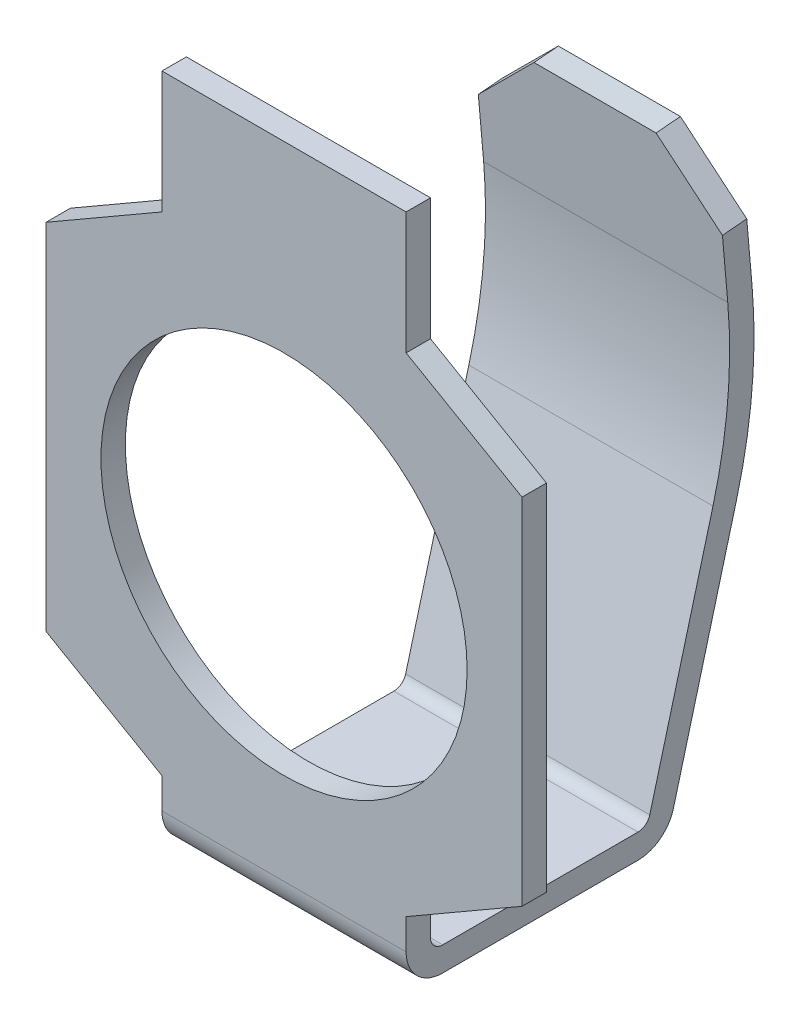
ISO-10303-21;
HEADER;
FILE_DESCRIPTION(('STEP AP214'),'2;1');
FILE_NAME('part.step','',(''),(''),'','','');
FILE_SCHEMA(('AUTOMOTIVE_DESIGN { 1 0 10303 214 1 1 1 1 }'));
ENDSEC;
DATA;
#1=APPLICATION_CONTEXT('core data for automotive mechanical design processes');
#2=APPLICATION_PROTOCOL_DEFINITION('international standard','automotive_design',2000,#1);
#3=PRODUCT_CONTEXT('',#1,'mechanical');
#4=PRODUCT('Part','Part','',(#3));
#5=PRODUCT_RELATED_PRODUCT_CATEGORY('part','',(#4));
#6=PRODUCT_DEFINITION_FORMATION('','',#4);
#7=PRODUCT_DEFINITION_CONTEXT('part definition',#1,'design');
#8=PRODUCT_DEFINITION('design','',#6,#7);
#9=PRODUCT_DEFINITION_SHAPE('','',#8);
#10=(LENGTH_UNIT() NAMED_UNIT(*) SI_UNIT(.MILLI.,.METRE.));
#11=(NAMED_UNIT(*) PLANE_ANGLE_UNIT() SI_UNIT($,.RADIAN.));
#12=(NAMED_UNIT(*) SI_UNIT($,.STERADIAN.) SOLID_ANGLE_UNIT());
#13=UNCERTAINTY_MEASURE_WITH_UNIT(LENGTH_MEASURE(1.E-05),#10,'distance_accuracy_value','');
#14=(GEOMETRIC_REPRESENTATION_CONTEXT(3) GLOBAL_UNCERTAINTY_ASSIGNED_CONTEXT((#13)) GLOBAL_UNIT_ASSIGNED_CONTEXT((#10,
#11,#12)) REPRESENTATION_CONTEXT('',''));
#15=CARTESIAN_POINT('',(0.,0.,0.));
#16=DIRECTION('',(0.,0.,1.));
#17=DIRECTION('',(1.,0.,0.));
#18=AXIS2_PLACEMENT_3D('',#15,#16,#17);
#19=CARTESIAN_POINT('',(0.,-6.70559839852,-3.313710709838));
#20=DIRECTION('',(0.,0.0871557427476379,-0.996194698091747));
#21=DIRECTION('',(0.,0.996194698091747,0.0871557427476379));
#22=AXIS2_PLACEMENT_3D('',#19,#20,#21);
#23=PLANE('',#22);
#24=DIRECTION('',(-1.,0.,0.));
#25=VECTOR('',#24,1.);
#26=CARTESIAN_POINT('',(1.,1.05730004801803,-2.63454509966334));
#27=LINE('',#26,#25);
#28=CARTESIAN_POINT('',(-0.999999999999995,1.05730004801875,-2.63454509966311));
#29=VERTEX_POINT('',#28);
#30=CARTESIAN_POINT('',(1.,1.05730004801875,-2.63454509966311));
#31=VERTEX_POINT('',#30);
#32=EDGE_CURVE('E194',#29,#31,#27,.F.);
#33=ORIENTED_EDGE('',*,*,#32,.F.);
#34=DIRECTION('',(0.,-0.996194698091718,-0.0871557427479758));
#35=VECTOR('',#34,1.);
#36=CARTESIAN_POINT('',(-1.,1.555397397064,-2.590967228289));
#37=LINE('',#36,#35);
#38=CARTESIAN_POINT('',(-1.00000000000007,1.55539739706407,-2.59096722828899));
#39=VERTEX_POINT('',#38);
#40=EDGE_CURVE('E210',#39,#29,#37,.T.);
#41=ORIENTED_EDGE('',*,*,#40,.F.);
#42=DIRECTION('',(0.707106781186442,0.704416026402845,0.0616284167164527));
#43=VECTOR('',#42,1.);
#44=CARTESIAN_POINT('',(-1.00000000000011,1.55539739706411,-2.59096722828899));
#45=LINE('',#44,#43);
#46=CARTESIAN_POINT('',(-0.500000000000116,2.05349474610991,-2.54738935691501));
#47=VERTEX_POINT('',#46);
#48=EDGE_CURVE('E213',#39,#47,#45,.T.);
#49=ORIENTED_EDGE('',*,*,#48,.T.);
#50=DIRECTION('',(1.,0.,0.));
#51=VECTOR('',#50,1.);
#52=CARTESIAN_POINT('',(-1.,2.0534947461095,-2.54738935691504));
#53=LINE('',#52,#51);
#54=CARTESIAN_POINT('',(0.500000000000046,2.05349474610988,-2.54738935691501));
#55=VERTEX_POINT('',#54);
#56=EDGE_CURVE('E226',#55,#47,#53,.F.);
#57=ORIENTED_EDGE('',*,*,#56,.F.);
#58=DIRECTION('',(0.707106781186442,-0.704416026402845,-0.0616284167164533));
#59=VECTOR('',#58,1.);
#60=CARTESIAN_POINT('',(0.500000000000069,2.05349474611007,-2.547389356915));
#61=LINE('',#60,#59);
#62=CARTESIAN_POINT('',(1.00000000000002,1.55539739706402,-2.590967228289));
#63=VERTEX_POINT('',#62);
#64=EDGE_CURVE('E209',#55,#63,#61,.T.);
#65=ORIENTED_EDGE('',*,*,#64,.T.);
#66=DIRECTION('',(0.,0.996194698091718,0.0871557427479758));
#67=VECTOR('',#66,1.);
#68=CARTESIAN_POINT('',(1.,1.057300048018,-2.634545099663));
#69=LINE('',#68,#67);
#70=EDGE_CURVE('E206',#31,#63,#69,.T.);
#71=ORIENTED_EDGE('',*,*,#70,.F.);
#72=EDGE_LOOP('',(#33,#41,#49,#57,#65,#71));
#73=FACE_BOUND('',#72,.T.);
#74=ADVANCED_FACE('F17',(#73),#23,.T.);
#75=CARTESIAN_POINT('',(-1.,2.03606359756,-2.348150417297));
#76=DIRECTION('',(0.,0.996194698091747,0.0871557427476379));
#77=DIRECTION('',(0.,-0.0871557427476379,0.996194698091747));
#78=AXIS2_PLACEMENT_3D('',#75,#76,#77);
#79=PLANE('',#78);
#80=DIRECTION('',(-1.25659031791263E-12,0.0871557427488806,-0.996194698091639));
#81=VECTOR('',#80,1.);
#82=CARTESIAN_POINT('',(0.50000000000032,2.03606359756032,-2.34815041729697));
#83=LINE('',#82,#81);
#84=CARTESIAN_POINT('',(0.500000000000107,2.03606359756014,-2.34815041729741));
#85=VERTEX_POINT('',#84);
#86=EDGE_CURVE('E215',#85,#55,#83,.T.);
#87=ORIENTED_EDGE('',*,*,#86,.T.);
#88=ORIENTED_EDGE('',*,*,#56,.T.);
#89=DIRECTION('',(-1.25713241899887E-12,-0.0871557427488804,0.996194698091639));
#90=VECTOR('',#89,1.);
#91=CARTESIAN_POINT('',(-0.500000000000116,2.05349474611012,-2.54738935691499));
#92=LINE('',#91,#90);
#93=CARTESIAN_POINT('',(-0.500000000000184,2.03606359756016,-2.3481504172974));
#94=VERTEX_POINT('',#93);
#95=EDGE_CURVE('E223',#47,#94,#92,.T.);
#96=ORIENTED_EDGE('',*,*,#95,.T.);
#97=DIRECTION('',(1.,0.,0.));
#98=VECTOR('',#97,1.);
#99=CARTESIAN_POINT('',(0.,2.03606359756004,-2.34815041729742));
#100=LINE('',#99,#98);
#101=EDGE_CURVE('E273',#94,#85,#100,.T.);
#102=ORIENTED_EDGE('',*,*,#101,.T.);
#103=EDGE_LOOP('',(#87,#88,#96,#102));
#104=FACE_BOUND('',#103,.T.);
#105=ADVANCED_FACE('F307',(#104),#79,.T.);
#106=CARTESIAN_POINT('',(0.5,1.914045557714,-0.953477839969));
#107=DIRECTION('',(-0.707106781186654,-0.704416026402655,-0.0616284167161898));
#108=DIRECTION('',(0.705757556807847,-0.708453436020053,0.));
#109=AXIS2_PLACEMENT_3D('',#106,#107,#108);
#110=PLANE('',#109);
#111=DIRECTION('',(0.707106781186448,-0.704416026402859,-0.0616284167162135));
#112=VECTOR('',#111,1.);
#113=CARTESIAN_POINT('',(0.5,2.03606359756004,-2.34815041729742));
#114=LINE('',#113,#112);
#115=CARTESIAN_POINT('',(1.,1.53796624851402,-2.39172828867125));
#116=VERTEX_POINT('',#115);
#117=EDGE_CURVE('E276',#85,#116,#114,.T.);
#118=ORIENTED_EDGE('',*,*,#117,.T.);
#119=DIRECTION('',(0.,-0.0871557427501339,0.996194698091529));
#120=VECTOR('',#119,1.);
#121=CARTESIAN_POINT('',(1.,1.555397397064,-2.590967228289));
#122=LINE('',#121,#120);
#123=EDGE_CURVE('E211',#63,#116,#122,.T.);
#124=ORIENTED_EDGE('',*,*,#123,.F.);
#125=ORIENTED_EDGE('',*,*,#64,.F.);
#126=ORIENTED_EDGE('',*,*,#86,.F.);
#127=EDGE_LOOP('',(#118,#124,#125,#126));
#128=FACE_BOUND('',#127,.T.);
#129=ADVANCED_FACE('F310',(#128),#110,.F.);
#130=CARTESIAN_POINT('',(-1.,1.415948208668,-0.997055711342));
#131=DIRECTION('',(0.707106781186654,-0.704416026402655,-0.0616284167161898));
#132=DIRECTION('',(0.705757556807847,0.708453436020053,0.));
#133=AXIS2_PLACEMENT_3D('',#130,#131,#132);
#134=PLANE('',#133);
#135=DIRECTION('',(0.707106781186448,0.704416026402859,0.0616284167162135));
#136=VECTOR('',#135,1.);
#137=CARTESIAN_POINT('',(-1.,1.53796624851402,-2.39172828867125));
#138=LINE('',#137,#136);
#139=CARTESIAN_POINT('',(-1.00000000000012,1.53796624851414,-2.39172828867124));
#140=VERTEX_POINT('',#139);
#141=EDGE_CURVE('E320',#140,#94,#138,.T.);
#142=ORIENTED_EDGE('',*,*,#141,.T.);
#143=ORIENTED_EDGE('',*,*,#95,.F.);
#144=ORIENTED_EDGE('',*,*,#48,.F.);
#145=DIRECTION('',(1.25659031791263E-12,0.0871557427488815,-0.996194698091639));
#146=VECTOR('',#145,1.);
#147=CARTESIAN_POINT('',(-1.00000000000036,1.53796624851436,-2.39172828867097));
#148=LINE('',#147,#146);
#149=EDGE_CURVE('E201',#140,#39,#148,.T.);
#150=ORIENTED_EDGE('',*,*,#149,.F.);
#151=EDGE_LOOP('',(#142,#143,#144,#150));
#152=FACE_BOUND('',#151,.T.);
#153=ADVANCED_FACE('F733',(#152),#134,.F.);
#154=CARTESIAN_POINT('',(1.,0.691245928478,1.549472632322));
#155=DIRECTION('',(-1.,0.,0.));
#156=DIRECTION('',(0.,0.,1.));
#157=AXIS2_PLACEMENT_3D('',#154,#155,#156);
#158=CYLINDRICAL_SURFACE('',#157,4.2);
#159=DIRECTION('',(1.,0.,0.));
#160=VECTOR('',#159,1.);
#161=CARTESIAN_POINT('',(0.,-0.395794060953725,-2.50741583809471));
#162=LINE('',#161,#160);
#163=CARTESIAN_POINT('',(-1.,-0.395794060953155,-2.50741583809341));
#164=VERTEX_POINT('',#163);
#165=CARTESIAN_POINT('',(1.,-0.395794060953155,-2.50741583809341));
#166=VERTEX_POINT('',#165);
#167=EDGE_CURVE('E326',#164,#166,#162,.T.);
#168=ORIENTED_EDGE('',*,*,#167,.F.);
#169=CARTESIAN_POINT('',(-1.,0.691245928478,1.549472632322));
#170=DIRECTION('',(-1.,0.,0.));
#171=DIRECTION('',(0.,0.,1.));
#172=AXIS2_PLACEMENT_3D('',#169,#170,#171);
#173=CIRCLE('',#172,4.2);
#174=EDGE_CURVE('E197',#29,#164,#173,.T.);
#175=ORIENTED_EDGE('',*,*,#174,.F.);
#176=ORIENTED_EDGE('',*,*,#32,.T.);
#177=CARTESIAN_POINT('',(1.,0.691245928478,1.549472632322));
#178=DIRECTION('',(-1.,0.,0.));
#179=DIRECTION('',(0.,0.,1.));
#180=AXIS2_PLACEMENT_3D('',#177,#178,#179);
#181=CIRCLE('',#180,4.2);
#182=EDGE_CURVE('E20',#166,#31,#181,.F.);
#183=ORIENTED_EDGE('',*,*,#182,.F.);
#184=EDGE_LOOP('',(#168,#175,#176,#183));
#185=FACE_BOUND('',#184,.T.);
#186=ADVANCED_FACE('F196',(#185),#158,.T.);
#187=CARTESIAN_POINT('',(0.,-6.72302954707,-3.11447177022));
#188=DIRECTION('',(0.,0.0871557427476379,-0.996194698091747));
#189=DIRECTION('',(0.,0.996194698091747,0.0871557427476379));
#190=AXIS2_PLACEMENT_3D('',#187,#188,#189);
#191=PLANE('',#190);
#192=DIRECTION('',(0.,0.996194698091747,0.0871557427476379));
#193=VECTOR('',#192,1.);
#194=CARTESIAN_POINT('',(-1.,-6.72302954707,-3.11447177022));
#195=LINE('',#194,#193);
#196=CARTESIAN_POINT('',(-0.999999999999996,1.03986889946878,-2.43530616004499));
#197=VERTEX_POINT('',#196);
#198=EDGE_CURVE('E318',#197,#140,#195,.T.);
#199=ORIENTED_EDGE('',*,*,#198,.F.);
#200=DIRECTION('',(1.,0.,0.));
#201=VECTOR('',#200,1.);
#202=CARTESIAN_POINT('',(-1.,1.039868899469,-2.43530616004495));
#203=LINE('',#202,#201);
#204=CARTESIAN_POINT('',(1.,1.03986889946878,-2.43530616004499));
#205=VERTEX_POINT('',#204);
#206=EDGE_CURVE('E270',#197,#205,#203,.T.);
#207=ORIENTED_EDGE('',*,*,#206,.T.);
#208=DIRECTION('',(0.,0.996194698091747,0.0871557427476379));
#209=VECTOR('',#208,1.);
#210=CARTESIAN_POINT('',(1.,-6.72302954707,-3.11447177022));
#211=LINE('',#210,#209);
#212=EDGE_CURVE('E282',#116,#205,#211,.F.);
#213=ORIENTED_EDGE('',*,*,#212,.F.);
#214=ORIENTED_EDGE('',*,*,#117,.F.);
#215=ORIENTED_EDGE('',*,*,#101,.F.);
#216=ORIENTED_EDGE('',*,*,#141,.F.);
#217=EDGE_LOOP('',(#199,#207,#213,#214,#215,#216));
#218=FACE_BOUND('',#217,.T.);
#219=ADVANCED_FACE('F313',(#218),#191,.F.);
#220=CARTESIAN_POINT('',(0.,-6.547160148908,-0.859162262476));
#221=DIRECTION('',(0.,-0.258819045102985,-0.965925826288944));
#222=DIRECTION('',(0.,0.965925826288944,-0.258819045102985));
#223=AXIS2_PLACEMENT_3D('',#220,#221,#222);
#224=PLANE('',#223);
#225=ORIENTED_EDGE('',*,*,#167,.T.);
#226=DIRECTION('',(0.,0.965925826289069,-0.258819045102519));
#227=VECTOR('',#226,1.);
#228=CARTESIAN_POINT('',(1.,-2.327645713531,-1.989777747887));
#229=LINE('',#228,#227);
#230=CARTESIAN_POINT('',(1.,-2.32764571353088,-1.98977774788686));
#231=VERTEX_POINT('',#230);
#232=EDGE_CURVE('E187',#231,#166,#229,.T.);
#233=ORIENTED_EDGE('',*,*,#232,.F.);
#234=DIRECTION('',(-1.,0.,0.));
#235=VECTOR('',#234,1.);
#236=CARTESIAN_POINT('',(1.,-2.32764571353091,-1.98977774788668));
#237=LINE('',#236,#235);
#238=CARTESIAN_POINT('',(-1.,-2.32764571353088,-1.98977774788686));
#239=VERTEX_POINT('',#238);
#240=EDGE_CURVE('E266',#239,#231,#237,.F.);
#241=ORIENTED_EDGE('',*,*,#240,.F.);
#242=DIRECTION('',(0.,-0.965925826289069,0.258819045102519));
#243=VECTOR('',#242,1.);
#244=CARTESIAN_POINT('',(-1.,-0.395794060953,-2.507415838092));
#245=LINE('',#244,#243);
#246=EDGE_CURVE('E272',#164,#239,#245,.T.);
#247=ORIENTED_EDGE('',*,*,#246,.F.);
#248=EDGE_LOOP('',(#225,#233,#241,#247));
#249=FACE_BOUND('',#248,.T.);
#250=ADVANCED_FACE('F515',(#249),#224,.T.);
#251=CARTESIAN_POINT('',(-1.,0.691245928478,1.549472632322));
#252=DIRECTION('',(1.,0.,0.));
#253=DIRECTION('',(0.,0.,-1.));
#254=AXIS2_PLACEMENT_3D('',#251,#252,#253);
#255=CYLINDRICAL_SURFACE('',#254,4.);
#256=CARTESIAN_POINT('',(-1.,0.691245928478,1.549472632322));
#257=DIRECTION('',(1.,0.,0.));
#258=DIRECTION('',(0.,0.,-1.));
#259=AXIS2_PLACEMENT_3D('',#256,#257,#258);
#260=CIRCLE('',#259,4.);
#261=CARTESIAN_POINT('',(-1.,-0.344030251933333,-2.31423067283524));
#262=VERTEX_POINT('',#261);
#263=EDGE_CURVE('E267',#262,#197,#260,.T.);
#264=ORIENTED_EDGE('',*,*,#263,.F.);
#265=DIRECTION('',(1.,0.,0.));
#266=VECTOR('',#265,1.);
#267=CARTESIAN_POINT('',(0.,-0.344030251932726,-2.31423067283671));
#268=LINE('',#267,#266);
#269=CARTESIAN_POINT('',(1.,-0.344030251933333,-2.31423067283524));
#270=VERTEX_POINT('',#269);
#271=EDGE_CURVE('E343',#262,#270,#268,.T.);
#272=ORIENTED_EDGE('',*,*,#271,.T.);
#273=CARTESIAN_POINT('',(1.,0.691245928478,1.549472632322));
#274=DIRECTION('',(1.,0.,0.));
#275=DIRECTION('',(0.,0.,-1.));
#276=AXIS2_PLACEMENT_3D('',#273,#274,#275);
#277=CIRCLE('',#276,4.);
#278=EDGE_CURVE('E271',#205,#270,#277,.F.);
#279=ORIENTED_EDGE('',*,*,#278,.F.);
#280=ORIENTED_EDGE('',*,*,#206,.F.);
#281=EDGE_LOOP('',(#264,#272,#279,#280));
#282=FACE_BOUND('',#281,.T.);
#283=ADVANCED_FACE('F517',(#282),#255,.F.);
#284=CARTESIAN_POINT('',(1.,-2.25,-1.7));
#285=DIRECTION('',(-1.,0.,0.));
#286=DIRECTION('',(0.,0.,1.));
#287=AXIS2_PLACEMENT_3D('',#284,#285,#286);
#288=CYLINDRICAL_SURFACE('',#287,0.3);
#289=DIRECTION('',(1.,0.,0.));
#290=VECTOR('',#289,1.);
#291=CARTESIAN_POINT('',(0.,-2.55,-1.7));
#292=LINE('',#291,#290);
#293=CARTESIAN_POINT('',(-1.,-2.55,-1.7));
#294=VERTEX_POINT('',#293);
#295=CARTESIAN_POINT('',(1.,-2.55,-1.7));
#296=VERTEX_POINT('',#295);
#297=EDGE_CURVE('E261',#294,#296,#292,.T.);
#298=ORIENTED_EDGE('',*,*,#297,.F.);
#299=CARTESIAN_POINT('',(-1.,-2.25,-1.7));
#300=DIRECTION('',(-1.,0.,0.));
#301=DIRECTION('',(0.,0.,1.));
#302=AXIS2_PLACEMENT_3D('',#299,#300,#301);
#303=CIRCLE('',#302,0.3);
#304=EDGE_CURVE('E263',#239,#294,#303,.T.);
#305=ORIENTED_EDGE('',*,*,#304,.F.);
#306=ORIENTED_EDGE('',*,*,#240,.T.);
#307=CARTESIAN_POINT('',(1.,-2.25,-1.7));
#308=DIRECTION('',(-1.,0.,0.));
#309=DIRECTION('',(0.,0.,1.));
#310=AXIS2_PLACEMENT_3D('',#307,#308,#309);
#311=CIRCLE('',#310,0.3);
#312=EDGE_CURVE('E259',#296,#231,#311,.F.);
#313=ORIENTED_EDGE('',*,*,#312,.F.);
#314=EDGE_LOOP('',(#298,#305,#306,#313));
#315=FACE_BOUND('',#314,.T.);
#316=ADVANCED_FACE('F512',(#315),#288,.T.);
#317=CARTESIAN_POINT('',(0.,-6.495396339887,-0.665977097218));
#318=DIRECTION('',(0.,-0.258819045102985,-0.965925826288944));
#319=DIRECTION('',(0.,0.965925826288944,-0.258819045102985));
#320=AXIS2_PLACEMENT_3D('',#317,#318,#319);
#321=PLANE('',#320);
#322=DIRECTION('',(0.,0.965925826288944,-0.258819045102985));
#323=VECTOR('',#322,1.);
#324=CARTESIAN_POINT('',(1.,-6.495396339887,-0.665977097218));
#325=LINE('',#324,#323);
#326=CARTESIAN_POINT('',(1.,-2.27588190451039,-1.79659258262984));
#327=VERTEX_POINT('',#326);
#328=EDGE_CURVE('E262',#270,#327,#325,.F.);
#329=ORIENTED_EDGE('',*,*,#328,.F.);
#330=ORIENTED_EDGE('',*,*,#271,.F.);
#331=DIRECTION('',(0.,0.965925826288944,-0.258819045102985));
#332=VECTOR('',#331,1.);
#333=CARTESIAN_POINT('',(-1.,-6.495396339887,-0.665977097218));
#334=LINE('',#333,#332);
#335=CARTESIAN_POINT('',(-1.,-2.27588190451039,-1.79659258262984));
#336=VERTEX_POINT('',#335);
#337=EDGE_CURVE('E265',#336,#262,#334,.T.);
#338=ORIENTED_EDGE('',*,*,#337,.F.);
#339=DIRECTION('',(1.,0.,0.));
#340=VECTOR('',#339,1.);
#341=CARTESIAN_POINT('',(-1.,-2.27588190450999,-1.79659258262898));
#342=LINE('',#341,#340);
#343=EDGE_CURVE('E255',#336,#327,#342,.T.);
#344=ORIENTED_EDGE('',*,*,#343,.T.);
#345=EDGE_LOOP('',(#329,#330,#338,#344));
#346=FACE_BOUND('',#345,.T.);
#347=ADVANCED_FACE('F576',(#346),#321,.F.);
#348=CARTESIAN_POINT('',(0.,-2.55,2.432743338823));
#349=DIRECTION('',(0.,-1.,0.));
#350=DIRECTION('',(0.,0.,-1.));
#351=AXIS2_PLACEMENT_3D('',#348,#349,#350);
#352=PLANE('',#351);
#353=ORIENTED_EDGE('',*,*,#297,.T.);
#354=DIRECTION('',(0.,0.,-1.));
#355=VECTOR('',#354,1.);
#356=CARTESIAN_POINT('',(1.,-2.55,-1.7));
#357=LINE('',#356,#355);
#358=CARTESIAN_POINT('',(1.,-2.55,-0.1));
#359=VERTEX_POINT('',#358);
#360=EDGE_CURVE('E352',#359,#296,#357,.T.);
#361=ORIENTED_EDGE('',*,*,#360,.F.);
#362=DIRECTION('',(-1.,0.,0.));
#363=VECTOR('',#362,1.);
#364=CARTESIAN_POINT('',(1.,-2.55,-0.1));
#365=LINE('',#364,#363);
#366=CARTESIAN_POINT('',(-1.,-2.55,-0.1));
#367=VERTEX_POINT('',#366);
#368=EDGE_CURVE('E251',#367,#359,#365,.F.);
#369=ORIENTED_EDGE('',*,*,#368,.F.);
#370=DIRECTION('',(0.,0.,1.));
#371=VECTOR('',#370,1.);
#372=CARTESIAN_POINT('',(-1.,-2.55,-0.1));
#373=LINE('',#372,#371);
#374=EDGE_CURVE('E258',#294,#367,#373,.T.);
#375=ORIENTED_EDGE('',*,*,#374,.F.);
#376=EDGE_LOOP('',(#353,#361,#369,#375));
#377=FACE_BOUND('',#376,.T.);
#378=ADVANCED_FACE('F514',(#377),#352,.T.);
#379=CARTESIAN_POINT('',(-1.,-2.25,-1.7));
#380=DIRECTION('',(1.,0.,0.));
#381=DIRECTION('',(0.,0.,-1.));
#382=AXIS2_PLACEMENT_3D('',#379,#380,#381);
#383=CYLINDRICAL_SURFACE('',#382,0.1);
#384=CARTESIAN_POINT('',(-1.,-2.25,-1.7));
#385=DIRECTION('',(1.,0.,0.));
#386=DIRECTION('',(0.,0.,-1.));
#387=AXIS2_PLACEMENT_3D('',#384,#385,#386);
#388=CIRCLE('',#387,0.1);
#389=CARTESIAN_POINT('',(-1.,-2.35,-1.7));
#390=VERTEX_POINT('',#389);
#391=EDGE_CURVE('E252',#390,#336,#388,.T.);
#392=ORIENTED_EDGE('',*,*,#391,.F.);
#393=DIRECTION('',(1.,0.,0.));
#394=VECTOR('',#393,1.);
#395=CARTESIAN_POINT('',(0.,-2.35,-1.7));
#396=LINE('',#395,#394);
#397=CARTESIAN_POINT('',(1.,-2.35,-1.7));
#398=VERTEX_POINT('',#397);
#399=EDGE_CURVE('E357',#390,#398,#396,.T.);
#400=ORIENTED_EDGE('',*,*,#399,.T.);
#401=CARTESIAN_POINT('',(1.,-2.25,-1.7));
#402=DIRECTION('',(1.,0.,0.));
#403=DIRECTION('',(0.,0.,-1.));
#404=AXIS2_PLACEMENT_3D('',#401,#402,#403);
#405=CIRCLE('',#404,0.1);
#406=EDGE_CURVE('E256',#327,#398,#405,.F.);
#407=ORIENTED_EDGE('',*,*,#406,.F.);
#408=ORIENTED_EDGE('',*,*,#343,.F.);
#409=EDGE_LOOP('',(#392,#400,#407,#408));
#410=FACE_BOUND('',#409,.T.);
#411=ADVANCED_FACE('F570',(#410),#383,.F.);
#412=CARTESIAN_POINT('',(1.,-2.25,-0.1));
#413=DIRECTION('',(-1.,0.,0.));
#414=DIRECTION('',(0.,0.,1.));
#415=AXIS2_PLACEMENT_3D('',#412,#413,#414);
#416=CYLINDRICAL_SURFACE('',#415,0.3);
#417=DIRECTION('',(1.,0.,0.));
#418=VECTOR('',#417,1.);
#419=CARTESIAN_POINT('',(0.,-2.25,0.2));
#420=LINE('',#419,#418);
#421=CARTESIAN_POINT('',(-1.,-2.25,0.2));
#422=VERTEX_POINT('',#421);
#423=CARTESIAN_POINT('',(1.,-2.25,0.2));
#424=VERTEX_POINT('',#423);
#425=EDGE_CURVE('E246',#422,#424,#420,.T.);
#426=ORIENTED_EDGE('',*,*,#425,.F.);
#427=CARTESIAN_POINT('',(-1.,-2.25,-0.1));
#428=DIRECTION('',(-1.,0.,0.));
#429=DIRECTION('',(0.,0.,1.));
#430=AXIS2_PLACEMENT_3D('',#427,#428,#429);
#431=CIRCLE('',#430,0.3);
#432=EDGE_CURVE('E248',#367,#422,#431,.T.);
#433=ORIENTED_EDGE('',*,*,#432,.F.);
#434=ORIENTED_EDGE('',*,*,#368,.T.);
#435=CARTESIAN_POINT('',(1.,-2.25,-0.1));
#436=DIRECTION('',(-1.,0.,0.));
#437=DIRECTION('',(0.,0.,1.));
#438=AXIS2_PLACEMENT_3D('',#435,#436,#437);
#439=CIRCLE('',#438,0.3);
#440=EDGE_CURVE('E244',#424,#359,#439,.F.);
#441=ORIENTED_EDGE('',*,*,#440,.F.);
#442=EDGE_LOOP('',(#426,#433,#434,#441));
#443=FACE_BOUND('',#442,.T.);
#444=ADVANCED_FACE('F507',(#443),#416,.T.);
#445=CARTESIAN_POINT('',(0.,-2.35,2.432743338823));
#446=DIRECTION('',(0.,-1.,0.));
#447=DIRECTION('',(0.,0.,-1.));
#448=AXIS2_PLACEMENT_3D('',#445,#446,#447);
#449=PLANE('',#448);
#450=DIRECTION('',(0.,0.,-1.));
#451=VECTOR('',#450,1.);
#452=CARTESIAN_POINT('',(1.,-2.35,2.432743338823));
#453=LINE('',#452,#451);
#454=CARTESIAN_POINT('',(1.,-2.35,-0.1));
#455=VERTEX_POINT('',#454);
#456=EDGE_CURVE('E247',#398,#455,#453,.F.);
#457=ORIENTED_EDGE('',*,*,#456,.F.);
#458=ORIENTED_EDGE('',*,*,#399,.F.);
#459=DIRECTION('',(0.,0.,-1.));
#460=VECTOR('',#459,1.);
#461=CARTESIAN_POINT('',(-1.,-2.35,2.432743338823));
#462=LINE('',#461,#460);
#463=CARTESIAN_POINT('',(-1.,-2.35,-0.1));
#464=VERTEX_POINT('',#463);
#465=EDGE_CURVE('E250',#464,#390,#462,.T.);
#466=ORIENTED_EDGE('',*,*,#465,.F.);
#467=DIRECTION('',(1.,0.,0.));
#468=VECTOR('',#467,1.);
#469=CARTESIAN_POINT('',(-1.,-2.35,-0.1));
#470=LINE('',#469,#468);
#471=EDGE_CURVE('E240',#464,#455,#470,.T.);
#472=ORIENTED_EDGE('',*,*,#471,.T.);
#473=EDGE_LOOP('',(#457,#458,#466,#472));
#474=FACE_BOUND('',#473,.T.);
#475=ADVANCED_FACE('F563',(#474),#449,.F.);
#476=CARTESIAN_POINT('',(0.,0.,0.2));
#477=DIRECTION('',(0.,0.,1.));
#478=DIRECTION('',(1.,0.,0.));
#479=AXIS2_PLACEMENT_3D('',#476,#477,#478);
#480=PLANE('',#479);
#481=CARTESIAN_POINT('',(0.,0.,0.2));
#482=DIRECTION('',(0.,0.,1.));
#483=DIRECTION('',(1.,0.,0.));
#484=AXIS2_PLACEMENT_3D('',#481,#482,#483);
#485=CIRCLE('',#484,1.5);
#486=CARTESIAN_POINT('',(1.5,0.,0.2));
#487=VERTEX_POINT('',#486);
#488=EDGE_CURVE('E233',#487,#487,#485,.F.);
#489=ORIENTED_EDGE('',*,*,#488,.T.);
#490=EDGE_LOOP('',(#489));
#491=FACE_BOUND('',#490,.T.);
#492=DIRECTION('',(1.,0.,0.));
#493=VECTOR('',#492,1.);
#494=CARTESIAN_POINT('',(1.,3.,0.2));
#495=LINE('',#494,#493);
#496=CARTESIAN_POINT('',(-1.,3.,0.2));
#497=VERTEX_POINT('',#496);
#498=CARTESIAN_POINT('',(1.,3.,0.2));
#499=VERTEX_POINT('',#498);
#500=EDGE_CURVE('E417',#497,#499,#495,.T.);
#501=ORIENTED_EDGE('',*,*,#500,.F.);
#502=DIRECTION('',(0.,1.,0.));
#503=VECTOR('',#502,1.);
#504=CARTESIAN_POINT('',(-1.,3.,0.2));
#505=LINE('',#504,#503);
#506=CARTESIAN_POINT('',(-1.,2.,0.2));
#507=VERTEX_POINT('',#506);
#508=EDGE_CURVE('E424',#507,#497,#505,.T.);
#509=ORIENTED_EDGE('',*,*,#508,.F.);
#510=DIRECTION('',(-0.866025403784329,-0.50000000000019,0.));
#511=VECTOR('',#510,1.);
#512=CARTESIAN_POINT('',(-1.,2.,0.2));
#513=LINE('',#512,#511);
#514=CARTESIAN_POINT('',(-1.94999999999995,1.45151724426992,0.2));
#515=VERTEX_POINT('',#514);
#516=EDGE_CURVE('E387',#515,#507,#513,.F.);
#517=ORIENTED_EDGE('',*,*,#516,.F.);
#518=DIRECTION('',(0.,1.,0.));
#519=VECTOR('',#518,1.);
#520=CARTESIAN_POINT('',(-1.95,1.45151724427,0.2));
#521=LINE('',#520,#519);
#522=CARTESIAN_POINT('',(-1.95,-1.45151724427,0.2));
#523=VERTEX_POINT('',#522);
#524=EDGE_CURVE('E398',#523,#515,#521,.T.);
#525=ORIENTED_EDGE('',*,*,#524,.F.);
#526=DIRECTION('',(0.866025403784329,-0.50000000000019,0.));
#527=VECTOR('',#526,1.);
#528=CARTESIAN_POINT('',(-1.95,-1.45151724427,0.2));
#529=LINE('',#528,#527);
#530=CARTESIAN_POINT('',(-1.00000000000005,-2.00000000000008,0.2));
#531=VERTEX_POINT('',#530);
#532=EDGE_CURVE('E402',#531,#523,#529,.F.);
#533=ORIENTED_EDGE('',*,*,#532,.F.);
#534=DIRECTION('',(0.,1.,0.));
#535=VECTOR('',#534,1.);
#536=CARTESIAN_POINT('',(-1.,-2.,0.2));
#537=LINE('',#536,#535);
#538=EDGE_CURVE('E362',#422,#531,#537,.T.);
#539=ORIENTED_EDGE('',*,*,#538,.F.);
#540=ORIENTED_EDGE('',*,*,#425,.T.);
#541=DIRECTION('',(0.,1.,0.));
#542=VECTOR('',#541,1.);
#543=CARTESIAN_POINT('',(1.,-2.25,0.2));
#544=LINE('',#543,#542);
#545=CARTESIAN_POINT('',(1.00000000000001,-2.,0.2));
#546=VERTEX_POINT('',#545);
#547=EDGE_CURVE('E371',#546,#424,#544,.F.);
#548=ORIENTED_EDGE('',*,*,#547,.F.);
#549=DIRECTION('',(0.866025403784329,0.50000000000019,0.));
#550=VECTOR('',#549,1.);
#551=CARTESIAN_POINT('',(1.,-2.,0.2));
#552=LINE('',#551,#550);
#553=CARTESIAN_POINT('',(1.94999999999995,-1.45151724426992,0.2));
#554=VERTEX_POINT('',#553);
#555=EDGE_CURVE('E382',#554,#546,#552,.F.);
#556=ORIENTED_EDGE('',*,*,#555,.F.);
#557=DIRECTION('',(0.,1.,0.));
#558=VECTOR('',#557,1.);
#559=CARTESIAN_POINT('',(1.95,-1.45151724427,0.2));
#560=LINE('',#559,#558);
#561=CARTESIAN_POINT('',(1.95,1.45151724427,0.2));
#562=VERTEX_POINT('',#561);
#563=EDGE_CURVE('E381',#562,#554,#560,.F.);
#564=ORIENTED_EDGE('',*,*,#563,.F.);
#565=DIRECTION('',(-0.866025403784329,0.50000000000019,0.));
#566=VECTOR('',#565,1.);
#567=CARTESIAN_POINT('',(1.95,1.45151724427,0.2));
#568=LINE('',#567,#566);
#569=CARTESIAN_POINT('',(1.00000000000005,2.00000000000008,0.2));
#570=VERTEX_POINT('',#569);
#571=EDGE_CURVE('E409',#570,#562,#568,.F.);
#572=ORIENTED_EDGE('',*,*,#571,.F.);
#573=DIRECTION('',(0.,1.,0.));
#574=VECTOR('',#573,1.);
#575=CARTESIAN_POINT('',(1.,2.,0.2));
#576=LINE('',#575,#574);
#577=EDGE_CURVE('E413',#499,#570,#576,.F.);
#578=ORIENTED_EDGE('',*,*,#577,.F.);
#579=EDGE_LOOP('',(#501,#509,#517,#525,#533,#539,#540,#548,#556,#564,#572,#578));
#580=FACE_BOUND('',#579,.T.);
#581=ADVANCED_FACE('F502',(#491,#580),#480,.T.);
#582=CARTESIAN_POINT('',(-1.,2.,0.));
#583=DIRECTION('',(-0.50000000000019,0.866025403784329,0.));
#584=DIRECTION('',(-0.866025403784329,-0.50000000000019,0.));
#585=AXIS2_PLACEMENT_3D('',#582,#583,#584);
#586=PLANE('',#585);
#587=ORIENTED_EDGE('',*,*,#516,.T.);
#588=DIRECTION('',(0.,0.,1.));
#589=VECTOR('',#588,1.);
#590=CARTESIAN_POINT('',(-1.,2.,0.));
#591=LINE('',#590,#589);
#592=CARTESIAN_POINT('',(-1.,2.,0.));
#593=VERTEX_POINT('',#592);
#594=EDGE_CURVE('E421',#593,#507,#591,.T.);
#595=ORIENTED_EDGE('',*,*,#594,.F.);
#596=DIRECTION('',(-0.866025403784496,-0.499999999999901,0.));
#597=VECTOR('',#596,1.);
#598=CARTESIAN_POINT('',(-1.,2.,0.));
#599=LINE('',#598,#597);
#600=CARTESIAN_POINT('',(-1.94999999999991,1.45151724426984,0.));
#601=VERTEX_POINT('',#600);
#602=EDGE_CURVE('E236',#593,#601,#599,.T.);
#603=ORIENTED_EDGE('',*,*,#602,.T.);
#604=DIRECTION('',(0.,0.,1.));
#605=VECTOR('',#604,1.);
#606=CARTESIAN_POINT('',(-1.95,1.45151724427,0.));
#607=LINE('',#606,#605);
#608=EDGE_CURVE('E400',#515,#601,#607,.F.);
#609=ORIENTED_EDGE('',*,*,#608,.F.);
#610=EDGE_LOOP('',(#587,#595,#603,#609));
#611=FACE_BOUND('',#610,.T.);
#612=ADVANCED_FACE('F500',(#611),#586,.T.);
#613=CARTESIAN_POINT('',(-1.95,1.45151724427,0.));
#614=DIRECTION('',(-1.,0.,0.));
#615=DIRECTION('',(0.,0.,1.));
#616=AXIS2_PLACEMENT_3D('',#613,#614,#615);
#617=PLANE('',#616);
#618=ORIENTED_EDGE('',*,*,#524,.T.);
#619=ORIENTED_EDGE('',*,*,#608,.T.);
#620=DIRECTION('',(0.,1.,0.));
#621=VECTOR('',#620,1.);
#622=CARTESIAN_POINT('',(-1.95,0.,0.));
#623=LINE('',#622,#621);
#624=CARTESIAN_POINT('',(-1.95,-1.45151724427,0.));
#625=VERTEX_POINT('',#624);
#626=EDGE_CURVE('E429',#601,#625,#623,.F.);
#627=ORIENTED_EDGE('',*,*,#626,.T.);
#628=DIRECTION('',(0.,0.,1.));
#629=VECTOR('',#628,1.);
#630=CARTESIAN_POINT('',(-1.95,-1.45151724427,0.));
#631=LINE('',#630,#629);
#632=EDGE_CURVE('E364',#523,#625,#631,.F.);
#633=ORIENTED_EDGE('',*,*,#632,.F.);
#634=EDGE_LOOP('',(#618,#619,#627,#633));
#635=FACE_BOUND('',#634,.T.);
#636=ADVANCED_FACE('F496',(#635),#617,.T.);
#637=CARTESIAN_POINT('',(-1.95,-1.45151724427,0.));
#638=DIRECTION('',(-0.50000000000019,-0.866025403784329,0.));
#639=DIRECTION('',(0.866025403784329,-0.50000000000019,0.));
#640=AXIS2_PLACEMENT_3D('',#637,#638,#639);
#641=PLANE('',#640);
#642=ORIENTED_EDGE('',*,*,#532,.T.);
#643=ORIENTED_EDGE('',*,*,#632,.T.);
#644=DIRECTION('',(0.866025403784496,-0.499999999999901,0.));
#645=VECTOR('',#644,1.);
#646=CARTESIAN_POINT('',(-1.95,-1.45151724427,0.));
#647=LINE('',#646,#645);
#648=CARTESIAN_POINT('',(-1.00000000000009,-2.00000000000016,0.));
#649=VERTEX_POINT('',#648);
#650=EDGE_CURVE('E376',#625,#649,#647,.T.);
#651=ORIENTED_EDGE('',*,*,#650,.T.);
#652=DIRECTION('',(0.,0.,1.));
#653=VECTOR('',#652,1.);
#654=CARTESIAN_POINT('',(-1.,-2.,0.));
#655=LINE('',#654,#653);
#656=EDGE_CURVE('E243',#531,#649,#655,.F.);
#657=ORIENTED_EDGE('',*,*,#656,.F.);
#658=EDGE_LOOP('',(#642,#643,#651,#657));
#659=FACE_BOUND('',#658,.T.);
#660=ADVANCED_FACE('F491',(#659),#641,.T.);
#661=CARTESIAN_POINT('',(-1.,-2.,0.));
#662=DIRECTION('',(-1.,0.,0.));
#663=DIRECTION('',(0.,0.,1.));
#664=AXIS2_PLACEMENT_3D('',#661,#662,#663);
#665=PLANE('',#664);
#666=ORIENTED_EDGE('',*,*,#538,.T.);
#667=ORIENTED_EDGE('',*,*,#656,.T.);
#668=DIRECTION('',(0.,1.,0.));
#669=VECTOR('',#668,1.);
#670=CARTESIAN_POINT('',(-1.,0.,0.));
#671=LINE('',#670,#669);
#672=CARTESIAN_POINT('',(-1.,-2.25,0.));
#673=VERTEX_POINT('',#672);
#674=EDGE_CURVE('E372',#649,#673,#671,.F.);
#675=ORIENTED_EDGE('',*,*,#674,.T.);
#676=CARTESIAN_POINT('',(-1.,-2.25,-0.1));
#677=DIRECTION('',(1.,0.,0.));
#678=DIRECTION('',(0.,0.,-1.));
#679=AXIS2_PLACEMENT_3D('',#676,#677,#678);
#680=CIRCLE('',#679,0.1);
#681=EDGE_CURVE('E237',#673,#464,#680,.T.);
#682=ORIENTED_EDGE('',*,*,#681,.T.);
#683=ORIENTED_EDGE('',*,*,#465,.T.);
#684=ORIENTED_EDGE('',*,*,#391,.T.);
#685=ORIENTED_EDGE('',*,*,#337,.T.);
#686=ORIENTED_EDGE('',*,*,#263,.T.);
#687=ORIENTED_EDGE('',*,*,#198,.T.);
#688=ORIENTED_EDGE('',*,*,#149,.T.);
#689=ORIENTED_EDGE('',*,*,#40,.T.);
#690=ORIENTED_EDGE('',*,*,#174,.T.);
#691=ORIENTED_EDGE('',*,*,#246,.T.);
#692=ORIENTED_EDGE('',*,*,#304,.T.);
#693=ORIENTED_EDGE('',*,*,#374,.T.);
#694=ORIENTED_EDGE('',*,*,#432,.T.);
#695=EDGE_LOOP('',(#666,#667,#675,#682,#683,#684,#685,#686,#687,#688,#689,#690,#691,#692,#693,#694));
#696=FACE_BOUND('',#695,.T.);
#697=ADVANCED_FACE('F487',(#696),#665,.T.);
#698=CARTESIAN_POINT('',(-1.,-2.25,-0.1));
#699=DIRECTION('',(1.,0.,0.));
#700=DIRECTION('',(0.,0.,-1.));
#701=AXIS2_PLACEMENT_3D('',#698,#699,#700);
#702=CYLINDRICAL_SURFACE('',#701,0.1);
#703=ORIENTED_EDGE('',*,*,#681,.F.);
#704=DIRECTION('',(1.,0.,0.));
#705=VECTOR('',#704,1.);
#706=CARTESIAN_POINT('',(0.,-2.25,0.));
#707=LINE('',#706,#705);
#708=CARTESIAN_POINT('',(1.,-2.25,0.));
#709=VERTEX_POINT('',#708);
#710=EDGE_CURVE('E375',#673,#709,#707,.T.);
#711=ORIENTED_EDGE('',*,*,#710,.T.);
#712=CARTESIAN_POINT('',(1.,-2.25,-0.1));
#713=DIRECTION('',(1.,0.,0.));
#714=DIRECTION('',(0.,0.,-1.));
#715=AXIS2_PLACEMENT_3D('',#712,#713,#714);
#716=CIRCLE('',#715,0.1);
#717=EDGE_CURVE('E241',#455,#709,#716,.F.);
#718=ORIENTED_EDGE('',*,*,#717,.F.);
#719=ORIENTED_EDGE('',*,*,#471,.F.);
#720=EDGE_LOOP('',(#703,#711,#718,#719));
#721=FACE_BOUND('',#720,.T.);
#722=ADVANCED_FACE('F485',(#721),#702,.F.);
#723=CARTESIAN_POINT('',(1.,-2.25,0.));
#724=DIRECTION('',(1.,0.,0.));
#725=DIRECTION('',(0.,1.,0.));
#726=AXIS2_PLACEMENT_3D('',#723,#724,#725);
#727=PLANE('',#726);
#728=ORIENTED_EDGE('',*,*,#547,.T.);
#729=ORIENTED_EDGE('',*,*,#440,.T.);
#730=ORIENTED_EDGE('',*,*,#360,.T.);
#731=ORIENTED_EDGE('',*,*,#312,.T.);
#732=ORIENTED_EDGE('',*,*,#232,.T.);
#733=ORIENTED_EDGE('',*,*,#182,.T.);
#734=ORIENTED_EDGE('',*,*,#70,.T.);
#735=ORIENTED_EDGE('',*,*,#123,.T.);
#736=ORIENTED_EDGE('',*,*,#212,.T.);
#737=ORIENTED_EDGE('',*,*,#278,.T.);
#738=ORIENTED_EDGE('',*,*,#328,.T.);
#739=ORIENTED_EDGE('',*,*,#406,.T.);
#740=ORIENTED_EDGE('',*,*,#456,.T.);
#741=ORIENTED_EDGE('',*,*,#717,.T.);
#742=DIRECTION('',(0.,1.,0.));
#743=VECTOR('',#742,1.);
#744=CARTESIAN_POINT('',(1.,0.,0.));
#745=LINE('',#744,#743);
#746=CARTESIAN_POINT('',(1.00000000000001,-2.,0.));
#747=VERTEX_POINT('',#746);
#748=EDGE_CURVE('E390',#709,#747,#745,.T.);
#749=ORIENTED_EDGE('',*,*,#748,.T.);
#750=DIRECTION('',(0.,0.,1.));
#751=VECTOR('',#750,1.);
#752=CARTESIAN_POINT('',(1.,-2.,0.));
#753=LINE('',#752,#751);
#754=EDGE_CURVE('E379',#546,#747,#753,.F.);
#755=ORIENTED_EDGE('',*,*,#754,.F.);
#756=EDGE_LOOP('',(#728,#729,#730,#731,#732,#733,#734,#735,#736,#737,#738,#739,#740,#741,#749,#755));
#757=FACE_BOUND('',#756,.T.);
#758=ADVANCED_FACE('F205',(#757),#727,.T.);
#759=CARTESIAN_POINT('',(1.,-2.,0.));
#760=DIRECTION('',(0.50000000000019,-0.866025403784329,0.));
#761=DIRECTION('',(0.866025403784329,0.50000000000019,0.));
#762=AXIS2_PLACEMENT_3D('',#759,#760,#761);
#763=PLANE('',#762);
#764=ORIENTED_EDGE('',*,*,#555,.T.);
#765=ORIENTED_EDGE('',*,*,#754,.T.);
#766=DIRECTION('',(0.866025403784496,0.499999999999901,0.));
#767=VECTOR('',#766,1.);
#768=CARTESIAN_POINT('',(1.,-2.,0.));
#769=LINE('',#768,#767);
#770=CARTESIAN_POINT('',(1.94999999999991,-1.45151724426984,0.));
#771=VERTEX_POINT('',#770);
#772=EDGE_CURVE('E393',#747,#771,#769,.T.);
#773=ORIENTED_EDGE('',*,*,#772,.T.);
#774=DIRECTION('',(0.,0.,-1.));
#775=VECTOR('',#774,1.);
#776=CARTESIAN_POINT('',(1.95,-1.45151724427,0.));
#777=LINE('',#776,#775);
#778=EDGE_CURVE('E407',#554,#771,#777,.T.);
#779=ORIENTED_EDGE('',*,*,#778,.F.);
#780=EDGE_LOOP('',(#764,#765,#773,#779));
#781=FACE_BOUND('',#780,.T.);
#782=ADVANCED_FACE('F478',(#781),#763,.T.);
#783=CARTESIAN_POINT('',(1.95,-1.45151724427,0.));
#784=DIRECTION('',(1.,0.,0.));
#785=DIRECTION('',(0.,0.,-1.));
#786=AXIS2_PLACEMENT_3D('',#783,#784,#785);
#787=PLANE('',#786);
#788=ORIENTED_EDGE('',*,*,#563,.T.);
#789=ORIENTED_EDGE('',*,*,#778,.T.);
#790=DIRECTION('',(0.,1.,0.));
#791=VECTOR('',#790,1.);
#792=CARTESIAN_POINT('',(1.95,0.,0.));
#793=LINE('',#792,#791);
#794=CARTESIAN_POINT('',(1.95,1.45151724427,0.));
#795=VERTEX_POINT('',#794);
#796=EDGE_CURVE('E436',#771,#795,#793,.T.);
#797=ORIENTED_EDGE('',*,*,#796,.T.);
#798=DIRECTION('',(0.,0.,1.));
#799=VECTOR('',#798,1.);
#800=CARTESIAN_POINT('',(1.95,1.45151724427,0.));
#801=LINE('',#800,#799);
#802=EDGE_CURVE('E411',#562,#795,#801,.F.);
#803=ORIENTED_EDGE('',*,*,#802,.F.);
#804=EDGE_LOOP('',(#788,#789,#797,#803));
#805=FACE_BOUND('',#804,.T.);
#806=ADVANCED_FACE('F472',(#805),#787,.T.);
#807=CARTESIAN_POINT('',(1.95,1.45151724427,0.));
#808=DIRECTION('',(0.50000000000019,0.866025403784329,0.));
#809=DIRECTION('',(-0.866025403784329,0.50000000000019,0.));
#810=AXIS2_PLACEMENT_3D('',#807,#808,#809);
#811=PLANE('',#810);
#812=ORIENTED_EDGE('',*,*,#571,.T.);
#813=ORIENTED_EDGE('',*,*,#802,.T.);
#814=DIRECTION('',(-0.866025403784496,0.499999999999901,0.));
#815=VECTOR('',#814,1.);
#816=CARTESIAN_POINT('',(1.95,1.45151724427,0.));
#817=LINE('',#816,#815);
#818=CARTESIAN_POINT('',(1.00000000000009,2.00000000000016,0.));
#819=VERTEX_POINT('',#818);
#820=EDGE_CURVE('E439',#795,#819,#817,.T.);
#821=ORIENTED_EDGE('',*,*,#820,.T.);
#822=DIRECTION('',(0.,0.,-1.));
#823=VECTOR('',#822,1.);
#824=CARTESIAN_POINT('',(1.,2.,0.));
#825=LINE('',#824,#823);
#826=EDGE_CURVE('E415',#570,#819,#825,.T.);
#827=ORIENTED_EDGE('',*,*,#826,.F.);
#828=EDGE_LOOP('',(#812,#813,#821,#827));
#829=FACE_BOUND('',#828,.T.);
#830=ADVANCED_FACE('F468',(#829),#811,.T.);
#831=CARTESIAN_POINT('',(1.,2.,0.));
#832=DIRECTION('',(1.,0.,0.));
#833=DIRECTION('',(0.,0.,-1.));
#834=AXIS2_PLACEMENT_3D('',#831,#832,#833);
#835=PLANE('',#834);
#836=ORIENTED_EDGE('',*,*,#577,.T.);
#837=ORIENTED_EDGE('',*,*,#826,.T.);
#838=DIRECTION('',(0.,1.,0.));
#839=VECTOR('',#838,1.);
#840=CARTESIAN_POINT('',(1.,0.,0.));
#841=LINE('',#840,#839);
#842=CARTESIAN_POINT('',(1.,3.,0.));
#843=VERTEX_POINT('',#842);
#844=EDGE_CURVE('E442',#819,#843,#841,.T.);
#845=ORIENTED_EDGE('',*,*,#844,.T.);
#846=DIRECTION('',(0.,0.,1.));
#847=VECTOR('',#846,1.);
#848=CARTESIAN_POINT('',(1.,3.,0.));
#849=LINE('',#848,#847);
#850=EDGE_CURVE('E419',#499,#843,#849,.F.);
#851=ORIENTED_EDGE('',*,*,#850,.F.);
#852=EDGE_LOOP('',(#836,#837,#845,#851));
#853=FACE_BOUND('',#852,.T.);
#854=ADVANCED_FACE('F462',(#853),#835,.T.);
#855=CARTESIAN_POINT('',(1.,3.,0.));
#856=DIRECTION('',(0.,1.,0.));
#857=DIRECTION('',(0.,0.,1.));
#858=AXIS2_PLACEMENT_3D('',#855,#856,#857);
#859=PLANE('',#858);
#860=ORIENTED_EDGE('',*,*,#500,.T.);
#861=ORIENTED_EDGE('',*,*,#850,.T.);
#862=DIRECTION('',(1.,0.,0.));
#863=VECTOR('',#862,1.);
#864=CARTESIAN_POINT('',(0.,3.,0.));
#865=LINE('',#864,#863);
#866=CARTESIAN_POINT('',(-1.,3.,0.));
#867=VERTEX_POINT('',#866);
#868=EDGE_CURVE('E445',#843,#867,#865,.F.);
#869=ORIENTED_EDGE('',*,*,#868,.T.);
#870=DIRECTION('',(0.,0.,1.));
#871=VECTOR('',#870,1.);
#872=CARTESIAN_POINT('',(-1.,3.,0.));
#873=LINE('',#872,#871);
#874=EDGE_CURVE('E35',#497,#867,#873,.F.);
#875=ORIENTED_EDGE('',*,*,#874,.F.);
#876=EDGE_LOOP('',(#860,#861,#869,#875));
#877=FACE_BOUND('',#876,.T.);
#878=ADVANCED_FACE('F457',(#877),#859,.T.);
#879=CARTESIAN_POINT('',(-1.,3.,0.));
#880=DIRECTION('',(-1.,0.,0.));
#881=DIRECTION('',(0.,0.,1.));
#882=AXIS2_PLACEMENT_3D('',#879,#880,#881);
#883=PLANE('',#882);
#884=ORIENTED_EDGE('',*,*,#508,.T.);
#885=ORIENTED_EDGE('',*,*,#874,.T.);
#886=DIRECTION('',(0.,1.,0.));
#887=VECTOR('',#886,1.);
#888=CARTESIAN_POINT('',(-1.,0.,0.));
#889=LINE('',#888,#887);
#890=EDGE_CURVE('E26',#867,#593,#889,.F.);
#891=ORIENTED_EDGE('',*,*,#890,.T.);
#892=ORIENTED_EDGE('',*,*,#594,.T.);
#893=EDGE_LOOP('',(#884,#885,#891,#892));
#894=FACE_BOUND('',#893,.T.);
#895=ADVANCED_FACE('F448',(#894),#883,.T.);
#896=CARTESIAN_POINT('',(0.,0.,0.));
#897=DIRECTION('',(0.,0.,1.));
#898=DIRECTION('',(1.,0.,0.));
#899=AXIS2_PLACEMENT_3D('',#896,#897,#898);
#900=CYLINDRICAL_SURFACE('',#899,1.5);
#901=CARTESIAN_POINT('',(0.,0.,0.));
#902=DIRECTION('',(0.,0.,1.));
#903=DIRECTION('',(1.,0.,0.));
#904=AXIS2_PLACEMENT_3D('',#901,#902,#903);
#905=CIRCLE('',#904,1.5);
#906=CARTESIAN_POINT('',(1.5,0.,0.));
#907=VERTEX_POINT('',#906);
#908=EDGE_CURVE('E11',#907,#907,#905,.F.);
#909=ORIENTED_EDGE('',*,*,#908,.T.);
#910=EDGE_LOOP('',(#909));
#911=FACE_BOUND('',#910,.T.);
#912=ORIENTED_EDGE('',*,*,#488,.F.);
#913=EDGE_LOOP('',(#912));
#914=FACE_BOUND('',#913,.T.);
#915=ADVANCED_FACE('F527',(#911,#914),#900,.F.);
#916=CARTESIAN_POINT('',(0.,0.,0.));
#917=DIRECTION('',(0.,0.,1.));
#918=DIRECTION('',(1.,0.,0.));
#919=AXIS2_PLACEMENT_3D('',#916,#917,#918);
#920=PLANE('',#919);
#921=ORIENTED_EDGE('',*,*,#908,.F.);
#922=EDGE_LOOP('',(#921));
#923=FACE_BOUND('',#922,.T.);
#924=ORIENTED_EDGE('',*,*,#868,.F.);
#925=ORIENTED_EDGE('',*,*,#844,.F.);
#926=ORIENTED_EDGE('',*,*,#820,.F.);
#927=ORIENTED_EDGE('',*,*,#796,.F.);
#928=ORIENTED_EDGE('',*,*,#772,.F.);
#929=ORIENTED_EDGE('',*,*,#748,.F.);
#930=ORIENTED_EDGE('',*,*,#710,.F.);
#931=ORIENTED_EDGE('',*,*,#674,.F.);
#932=ORIENTED_EDGE('',*,*,#650,.F.);
#933=ORIENTED_EDGE('',*,*,#626,.F.);
#934=ORIENTED_EDGE('',*,*,#602,.F.);
#935=ORIENTED_EDGE('',*,*,#890,.F.);
#936=EDGE_LOOP('',(#924,#925,#926,#927,#928,#929,#930,#931,#932,#933,#934,#935));
#937=FACE_BOUND('',#936,.T.);
#938=ADVANCED_FACE('F453',(#923,#937),#920,.F.);
#939=CLOSED_SHELL('',(#74,#105,#129,#153,#186,#219,#250,#283,#316,#347,#378,#411,#444,#475,#581,
#612,#636,#660,#697,#722,#758,#782,#806,#830,#854,#878,#895,#915,#938));
#940=MANIFOLD_SOLID_BREP('B1',#939);
#941=ADVANCED_BREP_SHAPE_REPRESENTATION('',(#18,#940),#14);
#942=SHAPE_DEFINITION_REPRESENTATION(#9,#941);
ENDSEC;
END-ISO-10303-21;
